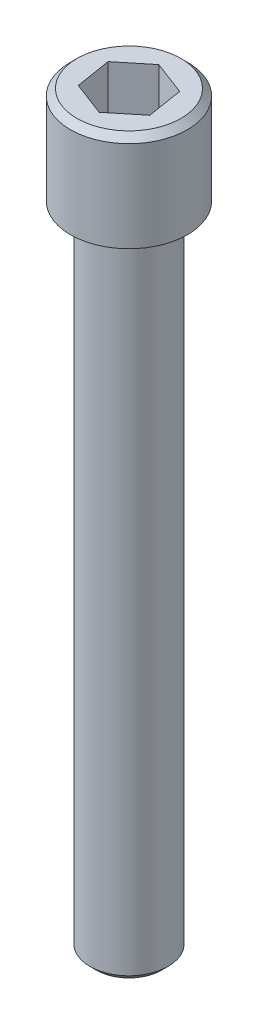
ISO-10303-21;
HEADER;
FILE_DESCRIPTION(('STEP AP214'),'2;1');
FILE_NAME('part.step','',(''),(''),'','','');
FILE_SCHEMA(('AUTOMOTIVE_DESIGN { 1 0 10303 214 1 1 1 1 }'));
ENDSEC;
DATA;
#1=APPLICATION_CONTEXT('core data for automotive mechanical design processes');
#2=APPLICATION_PROTOCOL_DEFINITION('international standard','automotive_design',2000,#1);
#3=PRODUCT_CONTEXT('',#1,'mechanical');
#4=PRODUCT('Part','Part','',(#3));
#5=PRODUCT_RELATED_PRODUCT_CATEGORY('part','',(#4));
#6=PRODUCT_DEFINITION_FORMATION('','',#4);
#7=PRODUCT_DEFINITION_CONTEXT('part definition',#1,'design');
#8=PRODUCT_DEFINITION('design','',#6,#7);
#9=PRODUCT_DEFINITION_SHAPE('','',#8);
#10=(LENGTH_UNIT() NAMED_UNIT(*) SI_UNIT(.MILLI.,.METRE.));
#11=(NAMED_UNIT(*) PLANE_ANGLE_UNIT() SI_UNIT($,.RADIAN.));
#12=(NAMED_UNIT(*) SI_UNIT($,.STERADIAN.) SOLID_ANGLE_UNIT());
#13=UNCERTAINTY_MEASURE_WITH_UNIT(LENGTH_MEASURE(1.E-05),#10,'distance_accuracy_value','');
#14=(GEOMETRIC_REPRESENTATION_CONTEXT(3) GLOBAL_UNCERTAINTY_ASSIGNED_CONTEXT((#13)) GLOBAL_UNIT_ASSIGNED_CONTEXT((#10,
#11,#12)) REPRESENTATION_CONTEXT('',''));
#15=CARTESIAN_POINT('',(0.,0.,0.));
#16=DIRECTION('',(0.,0.,1.));
#17=DIRECTION('',(1.,0.,0.));
#18=AXIS2_PLACEMENT_3D('',#15,#16,#17);
#19=CARTESIAN_POINT('',(0.,25.,0.));
#20=DIRECTION('',(0.,-1.,0.));
#21=DIRECTION('',(0.,0.,-1.));
#22=AXIS2_PLACEMENT_3D('',#19,#20,#21);
#23=CYLINDRICAL_SURFACE('',#22,1.5);
#24=CARTESIAN_POINT('',(0.,0.250000000000004,0.));
#25=DIRECTION('',(0.,1.,0.));
#26=DIRECTION('',(0.,0.,1.));
#27=AXIS2_PLACEMENT_3D('',#24,#25,#26);
#28=CIRCLE('',#27,1.5);
#29=CARTESIAN_POINT('',(0.,0.250000000000004,1.5));
#30=VERTEX_POINT('',#29);
#31=EDGE_CURVE('E41',#30,#30,#28,.T.);
#32=ORIENTED_EDGE('',*,*,#31,.T.);
#33=EDGE_LOOP('',(#32));
#34=FACE_BOUND('',#33,.T.);
#35=CARTESIAN_POINT('',(0.,25.,0.));
#36=DIRECTION('',(0.,1.,0.));
#37=DIRECTION('',(0.,0.,1.));
#38=AXIS2_PLACEMENT_3D('',#35,#36,#37);
#39=CIRCLE('',#38,1.5);
#40=CARTESIAN_POINT('',(0.,25.,1.5));
#41=VERTEX_POINT('',#40);
#42=EDGE_CURVE('E143',#41,#41,#39,.T.);
#43=ORIENTED_EDGE('',*,*,#42,.F.);
#44=EDGE_LOOP('',(#43));
#45=FACE_BOUND('',#44,.T.);
#46=ADVANCED_FACE('F33',(#34,#45),#23,.T.);
#47=CARTESIAN_POINT('',(0.,0.,0.));
#48=DIRECTION('',(0.,1.,0.));
#49=DIRECTION('',(0.,0.,1.));
#50=AXIS2_PLACEMENT_3D('',#47,#48,#49);
#51=PLANE('',#50);
#52=CARTESIAN_POINT('',(0.,0.,0.));
#53=DIRECTION('',(0.,1.,0.));
#54=DIRECTION('',(0.,0.,1.));
#55=AXIS2_PLACEMENT_3D('',#52,#53,#54);
#56=CIRCLE('',#55,1.25);
#57=CARTESIAN_POINT('',(0.,0.,1.25));
#58=VERTEX_POINT('',#57);
#59=EDGE_CURVE('E11',#58,#58,#56,.F.);
#60=ORIENTED_EDGE('',*,*,#59,.T.);
#61=EDGE_LOOP('',(#60));
#62=FACE_BOUND('',#61,.T.);
#63=ADVANCED_FACE('F165',(#62),#51,.F.);
#64=CARTESIAN_POINT('',(0.,28.75,0.));
#65=DIRECTION('',(0.,-1.,0.));
#66=DIRECTION('',(0.,0.,-1.));
#67=AXIS2_PLACEMENT_3D('',#64,#65,#66);
#68=CYLINDRICAL_SURFACE('',#67,2.25);
#69=CARTESIAN_POINT('',(0.,28.5,0.));
#70=DIRECTION('',(0.,1.,0.));
#71=DIRECTION('',(0.,0.,1.));
#72=AXIS2_PLACEMENT_3D('',#69,#70,#71);
#73=CIRCLE('',#72,2.25);
#74=CARTESIAN_POINT('',(0.,28.5,2.25));
#75=VERTEX_POINT('',#74);
#76=EDGE_CURVE('E149',#75,#75,#73,.F.);
#77=ORIENTED_EDGE('',*,*,#76,.T.);
#78=EDGE_LOOP('',(#77));
#79=FACE_BOUND('',#78,.T.);
#80=CARTESIAN_POINT('',(0.,25.,0.));
#81=DIRECTION('',(0.,1.,0.));
#82=DIRECTION('',(0.,0.,1.));
#83=AXIS2_PLACEMENT_3D('',#80,#81,#82);
#84=CIRCLE('',#83,2.25);
#85=CARTESIAN_POINT('',(0.,25.,2.25));
#86=VERTEX_POINT('',#85);
#87=EDGE_CURVE('E135',#86,#86,#84,.T.);
#88=ORIENTED_EDGE('',*,*,#87,.T.);
#89=EDGE_LOOP('',(#88));
#90=FACE_BOUND('',#89,.T.);
#91=ADVANCED_FACE('F170',(#79,#90),#68,.T.);
#92=CARTESIAN_POINT('',(0.,28.75,0.));
#93=DIRECTION('',(0.,1.,0.));
#94=DIRECTION('',(0.,0.,1.));
#95=AXIS2_PLACEMENT_3D('',#92,#93,#94);
#96=PLANE('',#95);
#97=CARTESIAN_POINT('',(0.,28.75,0.));
#98=DIRECTION('',(0.,1.,0.));
#99=DIRECTION('',(0.,0.,1.));
#100=AXIS2_PLACEMENT_3D('',#97,#98,#99);
#101=CIRCLE('',#100,2.);
#102=CARTESIAN_POINT('',(0.,28.75,2.));
#103=VERTEX_POINT('',#102);
#104=EDGE_CURVE('E146',#103,#103,#101,.T.);
#105=ORIENTED_EDGE('',*,*,#104,.T.);
#106=EDGE_LOOP('',(#105));
#107=FACE_BOUND('',#106,.T.);
#108=DIRECTION('',(0.159195520088402,0.,0.987247074639263));
#109=VECTOR('',#108,1.);
#110=CARTESIAN_POINT('',(-1.2949903812193,28.75,-0.492950213053497));
#111=LINE('',#110,#109);
#112=CARTESIAN_POINT('',(-1.2949903812193,28.75,-0.492950213053497));
#113=VERTEX_POINT('',#112);
#114=CARTESIAN_POINT('',(-1.07440259791493,28.75,0.875019461265662));
#115=VERTEX_POINT('',#114);
#116=EDGE_CURVE('E48',#113,#115,#111,.T.);
#117=ORIENTED_EDGE('',*,*,#116,.F.);
#118=DIRECTION('',(-0.775383286405273,0.,0.631490901884864));
#119=VECTOR('',#118,1.);
#120=CARTESIAN_POINT('',(-0.220587783304371,28.75,-1.36796967431916));
#121=LINE('',#120,#119);
#122=CARTESIAN_POINT('',(-0.220587783304371,28.75,-1.36796967431916));
#123=VERTEX_POINT('',#122);
#124=EDGE_CURVE('E131',#123,#113,#121,.T.);
#125=ORIENTED_EDGE('',*,*,#124,.F.);
#126=DIRECTION('',(-0.934578806493675,0.,-0.3557561727544));
#127=VECTOR('',#126,1.);
#128=CARTESIAN_POINT('',(1.07440259791493,28.75,-0.875019461265662));
#129=LINE('',#128,#127);
#130=CARTESIAN_POINT('',(1.07440259791493,28.75,-0.875019461265662));
#131=VERTEX_POINT('',#130);
#132=EDGE_CURVE('E129',#131,#123,#129,.T.);
#133=ORIENTED_EDGE('',*,*,#132,.F.);
#134=DIRECTION('',(-0.159195520088402,0.,-0.987247074639263));
#135=VECTOR('',#134,1.);
#136=CARTESIAN_POINT('',(1.2949903812193,28.75,0.492950213053496));
#137=LINE('',#136,#135);
#138=CARTESIAN_POINT('',(1.2949903812193,28.75,0.492950213053496));
#139=VERTEX_POINT('',#138);
#140=EDGE_CURVE('E96',#139,#131,#137,.T.);
#141=ORIENTED_EDGE('',*,*,#140,.F.);
#142=DIRECTION('',(0.775383286405273,0.,-0.631490901884864));
#143=VECTOR('',#142,1.);
#144=CARTESIAN_POINT('',(0.220587783304371,28.75,1.36796967431916));
#145=LINE('',#144,#143);
#146=CARTESIAN_POINT('',(0.220587783304371,28.75,1.36796967431916));
#147=VERTEX_POINT('',#146);
#148=EDGE_CURVE('E125',#147,#139,#145,.T.);
#149=ORIENTED_EDGE('',*,*,#148,.F.);
#150=DIRECTION('',(0.934578806493675,0.,0.3557561727544));
#151=VECTOR('',#150,1.);
#152=CARTESIAN_POINT('',(-1.07440259791493,28.75,0.875019461265662));
#153=LINE('',#152,#151);
#154=EDGE_CURVE('E122',#115,#147,#153,.T.);
#155=ORIENTED_EDGE('',*,*,#154,.F.);
#156=EDGE_LOOP('',(#117,#125,#133,#141,#149,#155));
#157=FACE_BOUND('',#156,.T.);
#158=ADVANCED_FACE('F176',(#107,#157),#96,.T.);
#159=CARTESIAN_POINT('',(0.,25.,0.));
#160=DIRECTION('',(0.,1.,0.));
#161=DIRECTION('',(0.,0.,1.));
#162=AXIS2_PLACEMENT_3D('',#159,#160,#161);
#163=PLANE('',#162);
#164=ORIENTED_EDGE('',*,*,#42,.T.);
#165=EDGE_LOOP('',(#164));
#166=FACE_BOUND('',#165,.T.);
#167=ORIENTED_EDGE('',*,*,#87,.F.);
#168=EDGE_LOOP('',(#167));
#169=FACE_BOUND('',#168,.T.);
#170=ADVANCED_FACE('F178',(#166,#169),#163,.F.);
#171=CARTESIAN_POINT('',(-1.2949903812193,26.5,-0.492950213053497));
#172=DIRECTION('',(-0.987247074639263,0.,0.159195520088402));
#173=DIRECTION('',(0.159195520088402,0.,0.987247074639263));
#174=AXIS2_PLACEMENT_3D('',#171,#172,#173);
#175=PLANE('',#174);
#176=ORIENTED_EDGE('',*,*,#116,.T.);
#177=DIRECTION('',(0.,1.,0.));
#178=VECTOR('',#177,1.);
#179=CARTESIAN_POINT('',(-1.07440259791493,26.5,0.875019461265662));
#180=LINE('',#179,#178);
#181=CARTESIAN_POINT('',(-1.07440259791493,26.5,0.875019461265662));
#182=VERTEX_POINT('',#181);
#183=EDGE_CURVE('E78',#182,#115,#180,.T.);
#184=ORIENTED_EDGE('',*,*,#183,.F.);
#185=DIRECTION('',(0.159195520088402,0.,0.987247074639263));
#186=VECTOR('',#185,1.);
#187=CARTESIAN_POINT('',(-1.2949903812193,26.5,-0.492950213053497));
#188=LINE('',#187,#186);
#189=CARTESIAN_POINT('',(-1.2949903812193,26.5,-0.492950213053497));
#190=VERTEX_POINT('',#189);
#191=EDGE_CURVE('E133',#190,#182,#188,.T.);
#192=ORIENTED_EDGE('',*,*,#191,.F.);
#193=DIRECTION('',(0.,1.,0.));
#194=VECTOR('',#193,1.);
#195=CARTESIAN_POINT('',(-1.2949903812193,26.5,-0.492950213053497));
#196=LINE('',#195,#194);
#197=EDGE_CURVE('E56',#190,#113,#196,.T.);
#198=ORIENTED_EDGE('',*,*,#197,.T.);
#199=EDGE_LOOP('',(#176,#184,#192,#198));
#200=FACE_BOUND('',#199,.T.);
#201=ADVANCED_FACE('F181',(#200),#175,.F.);
#202=CARTESIAN_POINT('',(-0.220587783304371,26.5,-1.36796967431916));
#203=DIRECTION('',(-0.631490901884864,0.,-0.775383286405273));
#204=DIRECTION('',(-0.775383286405273,0.,0.631490901884864));
#205=AXIS2_PLACEMENT_3D('',#202,#203,#204);
#206=PLANE('',#205);
#207=ORIENTED_EDGE('',*,*,#124,.T.);
#208=ORIENTED_EDGE('',*,*,#197,.F.);
#209=DIRECTION('',(-0.775383286405273,0.,0.631490901884864));
#210=VECTOR('',#209,1.);
#211=CARTESIAN_POINT('',(-0.220587783304371,26.5,-1.36796967431916));
#212=LINE('',#211,#210);
#213=CARTESIAN_POINT('',(-0.220587783304371,26.5,-1.36796967431916));
#214=VERTEX_POINT('',#213);
#215=EDGE_CURVE('E108',#214,#190,#212,.T.);
#216=ORIENTED_EDGE('',*,*,#215,.F.);
#217=DIRECTION('',(0.,1.,0.));
#218=VECTOR('',#217,1.);
#219=CARTESIAN_POINT('',(-0.220587783304371,26.5,-1.36796967431916));
#220=LINE('',#219,#218);
#221=EDGE_CURVE('E100',#214,#123,#220,.T.);
#222=ORIENTED_EDGE('',*,*,#221,.T.);
#223=EDGE_LOOP('',(#207,#208,#216,#222));
#224=FACE_BOUND('',#223,.T.);
#225=ADVANCED_FACE('F188',(#224),#206,.F.);
#226=CARTESIAN_POINT('',(1.07440259791493,26.5,-0.875019461265662));
#227=DIRECTION('',(0.3557561727544,0.,-0.934578806493675));
#228=DIRECTION('',(-0.934578806493675,0.,-0.3557561727544));
#229=AXIS2_PLACEMENT_3D('',#226,#227,#228);
#230=PLANE('',#229);
#231=ORIENTED_EDGE('',*,*,#132,.T.);
#232=ORIENTED_EDGE('',*,*,#221,.F.);
#233=DIRECTION('',(-0.934578806493675,0.,-0.3557561727544));
#234=VECTOR('',#233,1.);
#235=CARTESIAN_POINT('',(1.07440259791493,26.5,-0.875019461265662));
#236=LINE('',#235,#234);
#237=CARTESIAN_POINT('',(1.07440259791493,26.5,-0.875019461265662));
#238=VERTEX_POINT('',#237);
#239=EDGE_CURVE('E104',#238,#214,#236,.T.);
#240=ORIENTED_EDGE('',*,*,#239,.F.);
#241=DIRECTION('',(0.,1.,0.));
#242=VECTOR('',#241,1.);
#243=CARTESIAN_POINT('',(1.07440259791493,26.5,-0.875019461265662));
#244=LINE('',#243,#242);
#245=EDGE_CURVE('E89',#238,#131,#244,.T.);
#246=ORIENTED_EDGE('',*,*,#245,.T.);
#247=EDGE_LOOP('',(#231,#232,#240,#246));
#248=FACE_BOUND('',#247,.T.);
#249=ADVANCED_FACE('F105',(#248),#230,.F.);
#250=CARTESIAN_POINT('',(1.2949903812193,26.5,0.492950213053496));
#251=DIRECTION('',(0.987247074639263,0.,-0.159195520088402));
#252=DIRECTION('',(-0.159195520088403,0.,-0.987247074639263));
#253=AXIS2_PLACEMENT_3D('',#250,#251,#252);
#254=PLANE('',#253);
#255=ORIENTED_EDGE('',*,*,#140,.T.);
#256=ORIENTED_EDGE('',*,*,#245,.F.);
#257=DIRECTION('',(-0.159195520088402,0.,-0.987247074639263));
#258=VECTOR('',#257,1.);
#259=CARTESIAN_POINT('',(1.2949903812193,26.5,0.492950213053496));
#260=LINE('',#259,#258);
#261=CARTESIAN_POINT('',(1.2949903812193,26.5,0.492950213053496));
#262=VERTEX_POINT('',#261);
#263=EDGE_CURVE('E93',#262,#238,#260,.T.);
#264=ORIENTED_EDGE('',*,*,#263,.F.);
#265=DIRECTION('',(0.,1.,0.));
#266=VECTOR('',#265,1.);
#267=CARTESIAN_POINT('',(1.2949903812193,26.5,0.492950213053496));
#268=LINE('',#267,#266);
#269=EDGE_CURVE('E101',#262,#139,#268,.T.);
#270=ORIENTED_EDGE('',*,*,#269,.T.);
#271=EDGE_LOOP('',(#255,#256,#264,#270));
#272=FACE_BOUND('',#271,.T.);
#273=ADVANCED_FACE('F91',(#272),#254,.F.);
#274=CARTESIAN_POINT('',(0.220587783304371,26.5,1.36796967431916));
#275=DIRECTION('',(0.631490901884864,0.,0.775383286405273));
#276=DIRECTION('',(0.775383286405273,0.,-0.631490901884864));
#277=AXIS2_PLACEMENT_3D('',#274,#275,#276);
#278=PLANE('',#277);
#279=ORIENTED_EDGE('',*,*,#148,.T.);
#280=ORIENTED_EDGE('',*,*,#269,.F.);
#281=DIRECTION('',(0.775383286405273,0.,-0.631490901884864));
#282=VECTOR('',#281,1.);
#283=CARTESIAN_POINT('',(0.220587783304371,26.5,1.36796967431916));
#284=LINE('',#283,#282);
#285=CARTESIAN_POINT('',(0.220587783304371,26.5,1.36796967431916));
#286=VERTEX_POINT('',#285);
#287=EDGE_CURVE('E114',#286,#262,#284,.T.);
#288=ORIENTED_EDGE('',*,*,#287,.F.);
#289=DIRECTION('',(0.,1.,0.));
#290=VECTOR('',#289,1.);
#291=CARTESIAN_POINT('',(0.220587783304371,26.5,1.36796967431916));
#292=LINE('',#291,#290);
#293=EDGE_CURVE('E138',#286,#147,#292,.T.);
#294=ORIENTED_EDGE('',*,*,#293,.T.);
#295=EDGE_LOOP('',(#279,#280,#288,#294));
#296=FACE_BOUND('',#295,.T.);
#297=ADVANCED_FACE('F192',(#296),#278,.F.);
#298=CARTESIAN_POINT('',(-1.07440259791493,26.5,0.875019461265662));
#299=DIRECTION('',(-0.3557561727544,0.,0.934578806493675));
#300=DIRECTION('',(0.934578806493675,0.,0.3557561727544));
#301=AXIS2_PLACEMENT_3D('',#298,#299,#300);
#302=PLANE('',#301);
#303=ORIENTED_EDGE('',*,*,#154,.T.);
#304=ORIENTED_EDGE('',*,*,#293,.F.);
#305=DIRECTION('',(0.934578806493675,0.,0.3557561727544));
#306=VECTOR('',#305,1.);
#307=CARTESIAN_POINT('',(-1.07440259791493,26.5,0.875019461265662));
#308=LINE('',#307,#306);
#309=EDGE_CURVE('E116',#182,#286,#308,.T.);
#310=ORIENTED_EDGE('',*,*,#309,.F.);
#311=ORIENTED_EDGE('',*,*,#183,.T.);
#312=EDGE_LOOP('',(#303,#304,#310,#311));
#313=FACE_BOUND('',#312,.T.);
#314=ADVANCED_FACE('F189',(#313),#302,.F.);
#315=CARTESIAN_POINT('',(0.,26.5,0.));
#316=DIRECTION('',(0.,1.,0.));
#317=DIRECTION('',(0.,0.,1.));
#318=AXIS2_PLACEMENT_3D('',#315,#316,#317);
#319=PLANE('',#318);
#320=ORIENTED_EDGE('',*,*,#191,.T.);
#321=ORIENTED_EDGE('',*,*,#309,.T.);
#322=ORIENTED_EDGE('',*,*,#287,.T.);
#323=ORIENTED_EDGE('',*,*,#263,.T.);
#324=ORIENTED_EDGE('',*,*,#239,.T.);
#325=ORIENTED_EDGE('',*,*,#215,.T.);
#326=EDGE_LOOP('',(#320,#321,#322,#323,#324,#325));
#327=FACE_BOUND('',#326,.T.);
#328=ADVANCED_FACE('F111',(#327),#319,.T.);
#329=CARTESIAN_POINT('',(0.,28.75,0.));
#330=DIRECTION('',(0.,-1.,0.));
#331=DIRECTION('',(0.,0.,-1.));
#332=AXIS2_PLACEMENT_3D('',#329,#330,#331);
#333=CONICAL_SURFACE('',#332,2.,0.785398163397444);
#334=ORIENTED_EDGE('',*,*,#76,.F.);
#335=EDGE_LOOP('',(#334));
#336=FACE_BOUND('',#335,.T.);
#337=ORIENTED_EDGE('',*,*,#104,.F.);
#338=EDGE_LOOP('',(#337));
#339=FACE_BOUND('',#338,.T.);
#340=ADVANCED_FACE('F157',(#336,#339),#333,.T.);
#341=CARTESIAN_POINT('',(0.,0.250000000000004,0.));
#342=DIRECTION('',(0.,1.,0.));
#343=DIRECTION('',(0.,0.,1.));
#344=AXIS2_PLACEMENT_3D('',#341,#342,#343);
#345=CONICAL_SURFACE('',#344,1.5,0.785398163397445);
#346=ORIENTED_EDGE('',*,*,#59,.F.);
#347=EDGE_LOOP('',(#346));
#348=FACE_BOUND('',#347,.T.);
#349=ORIENTED_EDGE('',*,*,#31,.F.);
#350=EDGE_LOOP('',(#349));
#351=FACE_BOUND('',#350,.T.);
#352=ADVANCED_FACE('F35',(#348,#351),#345,.T.);
#353=CLOSED_SHELL('',(#46,#63,#91,#158,#170,#201,#225,#249,#273,#297,#314,#328,#340,#352));
#354=MANIFOLD_SOLID_BREP('B2',#353);
#355=ADVANCED_BREP_SHAPE_REPRESENTATION('',(#18,#354),#14);
#356=SHAPE_DEFINITION_REPRESENTATION(#9,#355);
ENDSEC;
END-ISO-10303-21;
